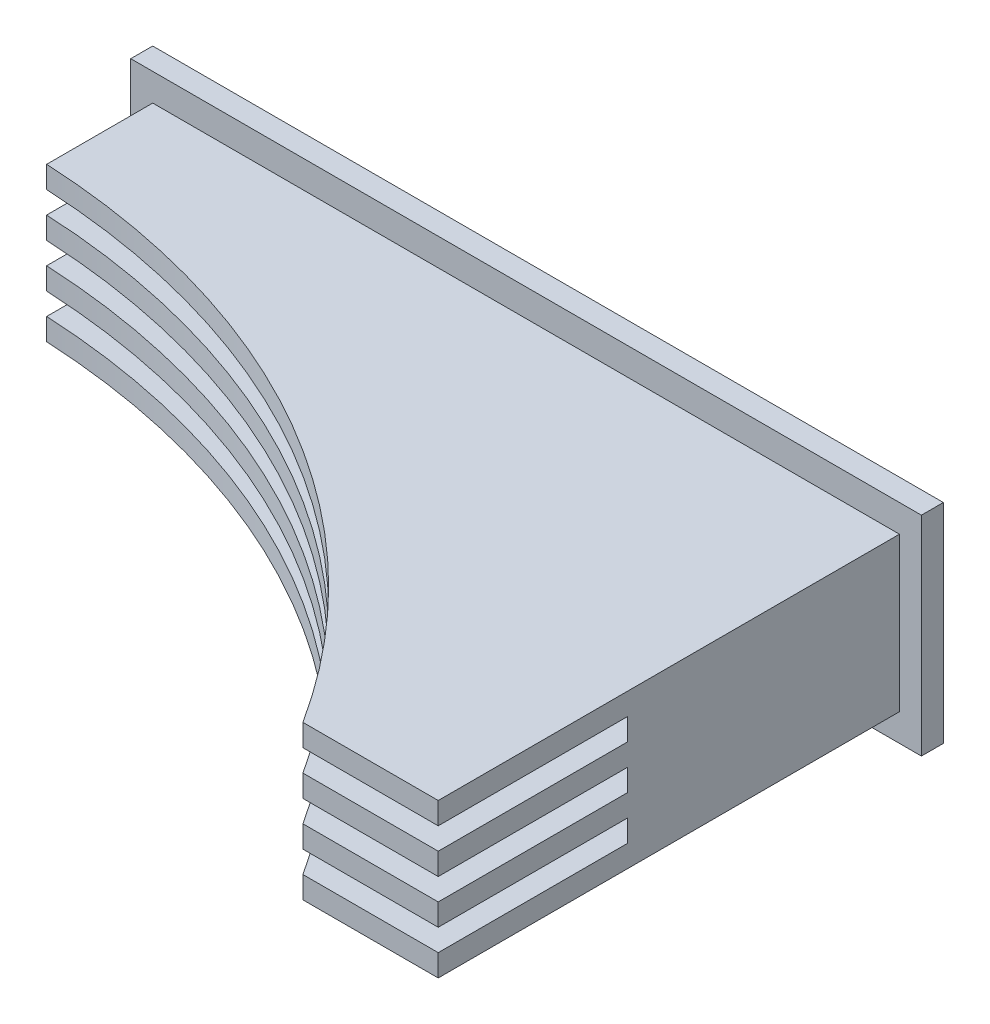
ISO-10303-21;
HEADER;
FILE_DESCRIPTION(('STEP AP214'),'2;1');
FILE_NAME('part.step','',(''),(''),'','','');
FILE_SCHEMA(('AUTOMOTIVE_DESIGN { 1 0 10303 214 1 1 1 1 }'));
ENDSEC;
DATA;
#1=APPLICATION_CONTEXT('core data for automotive mechanical design processes');
#2=APPLICATION_PROTOCOL_DEFINITION('international standard','automotive_design',2000,#1);
#3=PRODUCT_CONTEXT('',#1,'mechanical');
#4=PRODUCT('Part','Part','',(#3));
#5=PRODUCT_RELATED_PRODUCT_CATEGORY('part','',(#4));
#6=PRODUCT_DEFINITION_FORMATION('','',#4);
#7=PRODUCT_DEFINITION_CONTEXT('part definition',#1,'design');
#8=PRODUCT_DEFINITION('design','',#6,#7);
#9=PRODUCT_DEFINITION_SHAPE('','',#8);
#10=(LENGTH_UNIT() NAMED_UNIT(*) SI_UNIT(.MILLI.,.METRE.));
#11=(NAMED_UNIT(*) PLANE_ANGLE_UNIT() SI_UNIT($,.RADIAN.));
#12=(NAMED_UNIT(*) SI_UNIT($,.STERADIAN.) SOLID_ANGLE_UNIT());
#13=UNCERTAINTY_MEASURE_WITH_UNIT(LENGTH_MEASURE(1.E-05),#10,'distance_accuracy_value','');
#14=(GEOMETRIC_REPRESENTATION_CONTEXT(3) GLOBAL_UNCERTAINTY_ASSIGNED_CONTEXT((#13)) GLOBAL_UNIT_ASSIGNED_CONTEXT((#10,
#11,#12)) REPRESENTATION_CONTEXT('',''));
#15=CARTESIAN_POINT('',(0.,0.,0.));
#16=DIRECTION('',(0.,0.,1.));
#17=DIRECTION('',(1.,0.,0.));
#18=AXIS2_PLACEMENT_3D('',#15,#16,#17);
#19=CARTESIAN_POINT('',(-18.,15.5,1.));
#20=DIRECTION('',(0.,0.,1.));
#21=DIRECTION('',(1.,0.,0.));
#22=AXIS2_PLACEMENT_3D('',#19,#20,#21);
#23=PLANE('',#22);
#24=DIRECTION('',(0.,1.,0.));
#25=VECTOR('',#24,1.);
#26=CARTESIAN_POINT('',(17.,14.25,1.));
#27=LINE('',#26,#25);
#28=CARTESIAN_POINT('',(17.,7.25,1.));
#29=VERTEX_POINT('',#28);
#30=CARTESIAN_POINT('',(17.,14.25,1.));
#31=VERTEX_POINT('',#30);
#32=EDGE_CURVE('E370',#29,#31,#27,.T.);
#33=ORIENTED_EDGE('',*,*,#32,.F.);
#34=DIRECTION('',(-1.,0.,0.));
#35=VECTOR('',#34,1.);
#36=CARTESIAN_POINT('',(-18.,7.25,1.));
#37=LINE('',#36,#35);
#38=CARTESIAN_POINT('',(-17.,7.25,1.));
#39=VERTEX_POINT('',#38);
#40=EDGE_CURVE('E262',#29,#39,#37,.T.);
#41=ORIENTED_EDGE('',*,*,#40,.T.);
#42=DIRECTION('',(0.,1.,0.));
#43=VECTOR('',#42,1.);
#44=CARTESIAN_POINT('',(-17.,15.5,1.));
#45=LINE('',#44,#43);
#46=CARTESIAN_POINT('',(-17.,8.25,1.));
#47=VERTEX_POINT('',#46);
#48=EDGE_CURVE('E264',#39,#47,#45,.T.);
#49=ORIENTED_EDGE('',*,*,#48,.T.);
#50=DIRECTION('',(1.,0.,0.));
#51=VECTOR('',#50,1.);
#52=CARTESIAN_POINT('',(-18.,8.25,1.));
#53=LINE('',#52,#51);
#54=CARTESIAN_POINT('',(2.31515690696468,8.25,1.));
#55=VERTEX_POINT('',#54);
#56=EDGE_CURVE('E260',#47,#55,#53,.T.);
#57=ORIENTED_EDGE('',*,*,#56,.T.);
#58=DIRECTION('',(0.,1.,0.));
#59=VECTOR('',#58,1.);
#60=CARTESIAN_POINT('',(2.31515690696469,-11.9598693934321,1.00000000000001));
#61=LINE('',#60,#59);
#62=CARTESIAN_POINT('',(2.31515690696469,9.25000000000001,1.00000000000001));
#63=VERTEX_POINT('',#62);
#64=EDGE_CURVE('E223',#55,#63,#61,.T.);
#65=ORIENTED_EDGE('',*,*,#64,.T.);
#66=DIRECTION('',(-1.,0.,0.));
#67=VECTOR('',#66,1.);
#68=CARTESIAN_POINT('',(-18.,9.25,1.));
#69=LINE('',#68,#67);
#70=CARTESIAN_POINT('',(-17.,9.25,1.));
#71=VERTEX_POINT('',#70);
#72=EDGE_CURVE('E297',#63,#71,#69,.T.);
#73=ORIENTED_EDGE('',*,*,#72,.T.);
#74=DIRECTION('',(0.,1.,0.));
#75=VECTOR('',#74,1.);
#76=CARTESIAN_POINT('',(-17.,15.5,1.));
#77=LINE('',#76,#75);
#78=CARTESIAN_POINT('',(-17.,10.25,1.));
#79=VERTEX_POINT('',#78);
#80=EDGE_CURVE('E299',#71,#79,#77,.T.);
#81=ORIENTED_EDGE('',*,*,#80,.T.);
#82=DIRECTION('',(1.,0.,0.));
#83=VECTOR('',#82,1.);
#84=CARTESIAN_POINT('',(-18.,10.25,1.));
#85=LINE('',#84,#83);
#86=CARTESIAN_POINT('',(2.31515690696468,10.25,1.));
#87=VERTEX_POINT('',#86);
#88=EDGE_CURVE('E294',#79,#87,#85,.T.);
#89=ORIENTED_EDGE('',*,*,#88,.T.);
#90=CARTESIAN_POINT('',(2.31515690696469,11.25,1.00000000000001));
#91=VERTEX_POINT('',#90);
#92=EDGE_CURVE('E64',#87,#91,#61,.T.);
#93=ORIENTED_EDGE('',*,*,#92,.T.);
#94=DIRECTION('',(-1.,0.,0.));
#95=VECTOR('',#94,1.);
#96=CARTESIAN_POINT('',(-18.,11.25,1.));
#97=LINE('',#96,#95);
#98=CARTESIAN_POINT('',(-17.,11.25,1.));
#99=VERTEX_POINT('',#98);
#100=EDGE_CURVE('E334',#91,#99,#97,.T.);
#101=ORIENTED_EDGE('',*,*,#100,.T.);
#102=DIRECTION('',(0.,1.,0.));
#103=VECTOR('',#102,1.);
#104=CARTESIAN_POINT('',(-17.,15.5,1.));
#105=LINE('',#104,#103);
#106=CARTESIAN_POINT('',(-17.,12.25,1.));
#107=VERTEX_POINT('',#106);
#108=EDGE_CURVE('E336',#99,#107,#105,.T.);
#109=ORIENTED_EDGE('',*,*,#108,.T.);
#110=DIRECTION('',(1.,0.,0.));
#111=VECTOR('',#110,1.);
#112=CARTESIAN_POINT('',(-18.,12.25,1.));
#113=LINE('',#112,#111);
#114=CARTESIAN_POINT('',(2.31515690696468,12.25,1.));
#115=VERTEX_POINT('',#114);
#116=EDGE_CURVE('E331',#107,#115,#113,.T.);
#117=ORIENTED_EDGE('',*,*,#116,.T.);
#118=CARTESIAN_POINT('',(2.31515690696469,13.25,1.00000000000001));
#119=VERTEX_POINT('',#118);
#120=EDGE_CURVE('E56',#115,#119,#61,.T.);
#121=ORIENTED_EDGE('',*,*,#120,.T.);
#122=DIRECTION('',(1.,0.,0.));
#123=VECTOR('',#122,1.);
#124=CARTESIAN_POINT('',(-17.,13.25,1.));
#125=LINE('',#124,#123);
#126=CARTESIAN_POINT('',(-17.,13.25,1.));
#127=VERTEX_POINT('',#126);
#128=EDGE_CURVE('E373',#127,#119,#125,.T.);
#129=ORIENTED_EDGE('',*,*,#128,.F.);
#130=DIRECTION('',(0.,-1.,0.));
#131=VECTOR('',#130,1.);
#132=CARTESIAN_POINT('',(-17.,14.25,1.));
#133=LINE('',#132,#131);
#134=CARTESIAN_POINT('',(-17.,14.25,1.));
#135=VERTEX_POINT('',#134);
#136=EDGE_CURVE('E376',#135,#127,#133,.T.);
#137=ORIENTED_EDGE('',*,*,#136,.F.);
#138=DIRECTION('',(-1.,0.,0.));
#139=VECTOR('',#138,1.);
#140=CARTESIAN_POINT('',(-17.,14.25,1.));
#141=LINE('',#140,#139);
#142=EDGE_CURVE('E49',#31,#135,#141,.T.);
#143=ORIENTED_EDGE('',*,*,#142,.F.);
#144=EDGE_LOOP('',(#33,#41,#49,#57,#65,#73,#81,#89,#93,#101,#109,#117,#121,#129,#137,#143));
#145=FACE_BOUND('',#144,.T.);
#146=DIRECTION('',(-1.,0.,0.));
#147=VECTOR('',#146,1.);
#148=CARTESIAN_POINT('',(18.,15.5,1.));
#149=LINE('',#148,#147);
#150=CARTESIAN_POINT('',(18.,15.5,1.));
#151=VERTEX_POINT('',#150);
#152=CARTESIAN_POINT('',(-18.,15.5,1.));
#153=VERTEX_POINT('',#152);
#154=EDGE_CURVE('E340',#151,#153,#149,.T.);
#155=ORIENTED_EDGE('',*,*,#154,.T.);
#156=DIRECTION('',(0.,-1.,0.));
#157=VECTOR('',#156,1.);
#158=CARTESIAN_POINT('',(-18.,15.5,1.));
#159=LINE('',#158,#157);
#160=CARTESIAN_POINT('',(-18.,6.,1.));
#161=VERTEX_POINT('',#160);
#162=EDGE_CURVE('E343',#153,#161,#159,.T.);
#163=ORIENTED_EDGE('',*,*,#162,.T.);
#164=DIRECTION('',(1.,0.,0.));
#165=VECTOR('',#164,1.);
#166=CARTESIAN_POINT('',(-16.,6.,1.));
#167=LINE('',#166,#165);
#168=CARTESIAN_POINT('',(18.,6.,1.));
#169=VERTEX_POINT('',#168);
#170=EDGE_CURVE('E346',#161,#169,#167,.T.);
#171=ORIENTED_EDGE('',*,*,#170,.T.);
#172=DIRECTION('',(0.,1.,0.));
#173=VECTOR('',#172,1.);
#174=CARTESIAN_POINT('',(18.,6.,1.));
#175=LINE('',#174,#173);
#176=EDGE_CURVE('E348',#169,#151,#175,.T.);
#177=ORIENTED_EDGE('',*,*,#176,.T.);
#178=EDGE_LOOP('',(#155,#163,#171,#177));
#179=FACE_BOUND('',#178,.T.);
#180=ADVANCED_FACE('F41',(#145,#179),#23,.T.);
#181=CARTESIAN_POINT('',(-17.,14.25,22.));
#182=DIRECTION('',(1.,0.,0.));
#183=DIRECTION('',(0.,0.,-1.));
#184=AXIS2_PLACEMENT_3D('',#181,#182,#183);
#185=PLANE('',#184);
#186=DIRECTION('',(0.,0.,-1.));
#187=VECTOR('',#186,1.);
#188=CARTESIAN_POINT('',(-17.,14.25,22.));
#189=LINE('',#188,#187);
#190=CARTESIAN_POINT('',(-17.,14.25,5.82981428452992));
#191=VERTEX_POINT('',#190);
#192=EDGE_CURVE('E393',#191,#135,#189,.T.);
#193=ORIENTED_EDGE('',*,*,#192,.T.);
#194=ORIENTED_EDGE('',*,*,#136,.T.);
#195=DIRECTION('',(0.,0.,-1.));
#196=VECTOR('',#195,1.);
#197=CARTESIAN_POINT('',(-17.,13.25,22.));
#198=LINE('',#197,#196);
#199=CARTESIAN_POINT('',(-17.,13.25,5.82981428452992));
#200=VERTEX_POINT('',#199);
#201=EDGE_CURVE('E400',#200,#127,#198,.T.);
#202=ORIENTED_EDGE('',*,*,#201,.F.);
#203=DIRECTION('',(0.,-1.,0.));
#204=VECTOR('',#203,1.);
#205=CARTESIAN_POINT('',(-17.,74.3718064700863,5.82981428452992));
#206=LINE('',#205,#204);
#207=EDGE_CURVE('E379',#191,#200,#206,.T.);
#208=ORIENTED_EDGE('',*,*,#207,.F.);
#209=EDGE_LOOP('',(#193,#194,#202,#208));
#210=FACE_BOUND('',#209,.T.);
#211=ADVANCED_FACE('F43',(#210),#185,.F.);
#212=CARTESIAN_POINT('',(-17.,13.25,22.));
#213=DIRECTION('',(0.,1.,0.));
#214=DIRECTION('',(0.,0.,1.));
#215=AXIS2_PLACEMENT_3D('',#212,#213,#214);
#216=PLANE('',#215);
#217=ORIENTED_EDGE('',*,*,#128,.T.);
#218=CARTESIAN_POINT('',(-18.7210098337758,13.25,40.8421058876592));
#219=DIRECTION('',(0.,1.,0.));
#220=DIRECTION('',(0.,0.,1.));
#221=AXIS2_PLACEMENT_3D('',#218,#219,#220);
#222=CIRCLE('',#221,45.0545637278588);
#223=CARTESIAN_POINT('',(17.,13.25,13.3844444948352));
#224=VERTEX_POINT('',#223);
#225=EDGE_CURVE('E504',#119,#224,#222,.F.);
#226=ORIENTED_EDGE('',*,*,#225,.T.);
#227=DIRECTION('',(0.,0.,-1.));
#228=VECTOR('',#227,1.);
#229=CARTESIAN_POINT('',(17.,13.25,22.));
#230=LINE('',#229,#228);
#231=CARTESIAN_POINT('',(17.,13.25,22.));
#232=VERTEX_POINT('',#231);
#233=EDGE_CURVE('E398',#232,#224,#230,.T.);
#234=ORIENTED_EDGE('',*,*,#233,.F.);
#235=DIRECTION('',(1.,0.,0.));
#236=VECTOR('',#235,1.);
#237=CARTESIAN_POINT('',(-17.,13.25,22.));
#238=LINE('',#237,#236);
#239=CARTESIAN_POINT('',(10.8390558608188,13.25,22.));
#240=VERTEX_POINT('',#239);
#241=EDGE_CURVE('E387',#240,#232,#238,.T.);
#242=ORIENTED_EDGE('',*,*,#241,.F.);
#243=CARTESIAN_POINT('',(-18.7210098337758,13.25,40.8421058876592));
#244=DIRECTION('',(0.,1.,0.));
#245=DIRECTION('',(0.,0.,1.));
#246=AXIS2_PLACEMENT_3D('',#243,#244,#245);
#247=CIRCLE('',#246,35.0545637278588);
#248=EDGE_CURVE('E385',#240,#200,#247,.T.);
#249=ORIENTED_EDGE('',*,*,#248,.T.);
#250=ORIENTED_EDGE('',*,*,#201,.T.);
#251=EDGE_LOOP('',(#217,#226,#234,#242,#249,#250));
#252=FACE_BOUND('',#251,.T.);
#253=ADVANCED_FACE('F467',(#252),#216,.F.);
#254=CARTESIAN_POINT('',(17.,14.25,22.));
#255=DIRECTION('',(-1.,0.,0.));
#256=DIRECTION('',(0.,-1.,0.));
#257=AXIS2_PLACEMENT_3D('',#254,#255,#256);
#258=PLANE('',#257);
#259=ORIENTED_EDGE('',*,*,#233,.T.);
#260=DIRECTION('',(0.,1.,0.));
#261=VECTOR('',#260,1.);
#262=CARTESIAN_POINT('',(17.,-11.9598693934321,13.3844444948352));
#263=LINE('',#262,#261);
#264=CARTESIAN_POINT('',(17.,12.25,13.3844444948352));
#265=VERTEX_POINT('',#264);
#266=EDGE_CURVE('E241',#265,#224,#263,.T.);
#267=ORIENTED_EDGE('',*,*,#266,.F.);
#268=DIRECTION('',(0.,0.,-1.));
#269=VECTOR('',#268,1.);
#270=CARTESIAN_POINT('',(17.,12.25,22.));
#271=LINE('',#270,#269);
#272=CARTESIAN_POINT('',(17.,12.25,22.));
#273=VERTEX_POINT('',#272);
#274=EDGE_CURVE('E319',#273,#265,#271,.T.);
#275=ORIENTED_EDGE('',*,*,#274,.F.);
#276=DIRECTION('',(0.,1.,0.));
#277=VECTOR('',#276,1.);
#278=CARTESIAN_POINT('',(17.,12.25,22.));
#279=LINE('',#278,#277);
#280=CARTESIAN_POINT('',(17.,11.25,22.));
#281=VERTEX_POINT('',#280);
#282=EDGE_CURVE('E312',#281,#273,#279,.T.);
#283=ORIENTED_EDGE('',*,*,#282,.F.);
#284=DIRECTION('',(0.,0.,-1.));
#285=VECTOR('',#284,1.);
#286=CARTESIAN_POINT('',(17.,11.25,22.));
#287=LINE('',#286,#285);
#288=CARTESIAN_POINT('',(17.,11.25,13.3844444948352));
#289=VERTEX_POINT('',#288);
#290=EDGE_CURVE('E322',#281,#289,#287,.T.);
#291=ORIENTED_EDGE('',*,*,#290,.T.);
#292=CARTESIAN_POINT('',(17.,10.25,13.3844444948352));
#293=VERTEX_POINT('',#292);
#294=EDGE_CURVE('E239',#293,#289,#263,.T.);
#295=ORIENTED_EDGE('',*,*,#294,.F.);
#296=DIRECTION('',(0.,0.,-1.));
#297=VECTOR('',#296,1.);
#298=CARTESIAN_POINT('',(17.,10.25,22.));
#299=LINE('',#298,#297);
#300=CARTESIAN_POINT('',(17.,10.25,22.));
#301=VERTEX_POINT('',#300);
#302=EDGE_CURVE('E284',#301,#293,#299,.T.);
#303=ORIENTED_EDGE('',*,*,#302,.F.);
#304=DIRECTION('',(0.,1.,0.));
#305=VECTOR('',#304,1.);
#306=CARTESIAN_POINT('',(17.,10.25,22.));
#307=LINE('',#306,#305);
#308=CARTESIAN_POINT('',(17.,9.25,22.));
#309=VERTEX_POINT('',#308);
#310=EDGE_CURVE('E277',#309,#301,#307,.T.);
#311=ORIENTED_EDGE('',*,*,#310,.F.);
#312=DIRECTION('',(0.,0.,-1.));
#313=VECTOR('',#312,1.);
#314=CARTESIAN_POINT('',(17.,9.25,22.));
#315=LINE('',#314,#313);
#316=CARTESIAN_POINT('',(17.,9.25,13.3844444948352));
#317=VERTEX_POINT('',#316);
#318=EDGE_CURVE('E237',#309,#317,#315,.T.);
#319=ORIENTED_EDGE('',*,*,#318,.T.);
#320=CARTESIAN_POINT('',(17.,8.25,13.3844444948352));
#321=VERTEX_POINT('',#320);
#322=EDGE_CURVE('E220',#321,#317,#263,.T.);
#323=ORIENTED_EDGE('',*,*,#322,.F.);
#324=DIRECTION('',(0.,0.,-1.));
#325=VECTOR('',#324,1.);
#326=CARTESIAN_POINT('',(17.,8.25,22.));
#327=LINE('',#326,#325);
#328=CARTESIAN_POINT('',(17.,8.25,22.));
#329=VERTEX_POINT('',#328);
#330=EDGE_CURVE('E233',#329,#321,#327,.T.);
#331=ORIENTED_EDGE('',*,*,#330,.F.);
#332=DIRECTION('',(0.,1.,0.));
#333=VECTOR('',#332,1.);
#334=CARTESIAN_POINT('',(17.,8.25,22.));
#335=LINE('',#334,#333);
#336=CARTESIAN_POINT('',(17.,7.25,22.));
#337=VERTEX_POINT('',#336);
#338=EDGE_CURVE('E442',#337,#329,#335,.T.);
#339=ORIENTED_EDGE('',*,*,#338,.F.);
#340=DIRECTION('',(0.,0.,-1.));
#341=VECTOR('',#340,1.);
#342=CARTESIAN_POINT('',(17.,7.25,22.));
#343=LINE('',#342,#341);
#344=EDGE_CURVE('E245',#337,#29,#343,.T.);
#345=ORIENTED_EDGE('',*,*,#344,.T.);
#346=ORIENTED_EDGE('',*,*,#32,.T.);
#347=DIRECTION('',(0.,0.,-1.));
#348=VECTOR('',#347,1.);
#349=CARTESIAN_POINT('',(17.,14.25,22.));
#350=LINE('',#349,#348);
#351=CARTESIAN_POINT('',(17.,14.25,22.));
#352=VERTEX_POINT('',#351);
#353=EDGE_CURVE('E396',#352,#31,#350,.T.);
#354=ORIENTED_EDGE('',*,*,#353,.F.);
#355=DIRECTION('',(0.,1.,0.));
#356=VECTOR('',#355,1.);
#357=CARTESIAN_POINT('',(17.,14.25,22.));
#358=LINE('',#357,#356);
#359=EDGE_CURVE('E389',#232,#352,#358,.T.);
#360=ORIENTED_EDGE('',*,*,#359,.F.);
#361=EDGE_LOOP('',(#259,#267,#275,#283,#291,#295,#303,#311,#319,#323,#331,#339,#345,#346,#354,#360));
#362=FACE_BOUND('',#361,.T.);
#363=ADVANCED_FACE('F231',(#362),#258,.F.);
#364=CARTESIAN_POINT('',(-17.,14.25,22.));
#365=DIRECTION('',(0.,-1.,0.));
#366=DIRECTION('',(1.,0.,0.));
#367=AXIS2_PLACEMENT_3D('',#364,#365,#366);
#368=PLANE('',#367);
#369=ORIENTED_EDGE('',*,*,#353,.T.);
#370=ORIENTED_EDGE('',*,*,#142,.T.);
#371=ORIENTED_EDGE('',*,*,#192,.F.);
#372=CARTESIAN_POINT('',(-18.7210098337758,14.25,40.8421058876592));
#373=DIRECTION('',(0.,-1.,0.));
#374=DIRECTION('',(1.,0.,0.));
#375=AXIS2_PLACEMENT_3D('',#372,#373,#374);
#376=CIRCLE('',#375,35.0545637278588);
#377=CARTESIAN_POINT('',(10.8390558608187,14.25,22.));
#378=VERTEX_POINT('',#377);
#379=EDGE_CURVE('E382',#191,#378,#376,.T.);
#380=ORIENTED_EDGE('',*,*,#379,.T.);
#381=DIRECTION('',(-1.,0.,0.));
#382=VECTOR('',#381,1.);
#383=CARTESIAN_POINT('',(-17.,14.25,22.));
#384=LINE('',#383,#382);
#385=EDGE_CURVE('E391',#352,#378,#384,.T.);
#386=ORIENTED_EDGE('',*,*,#385,.F.);
#387=EDGE_LOOP('',(#369,#370,#371,#380,#386));
#388=FACE_BOUND('',#387,.T.);
#389=ADVANCED_FACE('F409',(#388),#368,.F.);
#390=CARTESIAN_POINT('',(-17.,13.25,22.));
#391=DIRECTION('',(0.,0.,1.));
#392=DIRECTION('',(1.,0.,0.));
#393=AXIS2_PLACEMENT_3D('',#390,#391,#392);
#394=PLANE('',#393);
#395=DIRECTION('',(0.,-1.,0.));
#396=VECTOR('',#395,1.);
#397=CARTESIAN_POINT('',(10.8390558608188,74.3718064700863,22.));
#398=LINE('',#397,#396);
#399=EDGE_CURVE('E403',#240,#378,#398,.F.);
#400=ORIENTED_EDGE('',*,*,#399,.F.);
#401=ORIENTED_EDGE('',*,*,#241,.T.);
#402=ORIENTED_EDGE('',*,*,#359,.T.);
#403=ORIENTED_EDGE('',*,*,#385,.T.);
#404=EDGE_LOOP('',(#400,#401,#402,#403));
#405=FACE_BOUND('',#404,.T.);
#406=ADVANCED_FACE('F421',(#405),#394,.T.);
#407=CARTESIAN_POINT('',(-18.7210098337758,74.3718064700863,40.8421058876592));
#408=DIRECTION('',(0.,-1.,0.));
#409=DIRECTION('',(1.,0.,0.));
#410=AXIS2_PLACEMENT_3D('',#407,#408,#409);
#411=CYLINDRICAL_SURFACE('',#410,35.0545637278588);
#412=ORIENTED_EDGE('',*,*,#248,.F.);
#413=ORIENTED_EDGE('',*,*,#399,.T.);
#414=ORIENTED_EDGE('',*,*,#379,.F.);
#415=ORIENTED_EDGE('',*,*,#207,.T.);
#416=EDGE_LOOP('',(#412,#413,#414,#415));
#417=FACE_BOUND('',#416,.T.);
#418=ADVANCED_FACE('F419',(#417),#411,.F.);
#419=CARTESIAN_POINT('',(18.,15.5,1.));
#420=DIRECTION('',(0.,-1.,0.));
#421=DIRECTION('',(0.,0.,-1.));
#422=AXIS2_PLACEMENT_3D('',#419,#420,#421);
#423=PLANE('',#422);
#424=DIRECTION('',(-1.,0.,0.));
#425=VECTOR('',#424,1.);
#426=CARTESIAN_POINT('',(18.,15.5,0.));
#427=LINE('',#426,#425);
#428=CARTESIAN_POINT('',(18.,15.5,0.));
#429=VERTEX_POINT('',#428);
#430=CARTESIAN_POINT('',(-18.,15.5,0.));
#431=VERTEX_POINT('',#430);
#432=EDGE_CURVE('E339',#429,#431,#427,.T.);
#433=ORIENTED_EDGE('',*,*,#432,.T.);
#434=DIRECTION('',(0.,0.,-1.));
#435=VECTOR('',#434,1.);
#436=CARTESIAN_POINT('',(-18.,15.5,1.));
#437=LINE('',#436,#435);
#438=EDGE_CURVE('E367',#153,#431,#437,.T.);
#439=ORIENTED_EDGE('',*,*,#438,.F.);
#440=ORIENTED_EDGE('',*,*,#154,.F.);
#441=DIRECTION('',(0.,0.,-1.));
#442=VECTOR('',#441,1.);
#443=CARTESIAN_POINT('',(18.,15.5,1.));
#444=LINE('',#443,#442);
#445=EDGE_CURVE('E350',#151,#429,#444,.T.);
#446=ORIENTED_EDGE('',*,*,#445,.T.);
#447=EDGE_LOOP('',(#433,#439,#440,#446));
#448=FACE_BOUND('',#447,.T.);
#449=ADVANCED_FACE('F484',(#448),#423,.F.);
#450=CARTESIAN_POINT('',(-18.,15.5,1.));
#451=DIRECTION('',(1.,0.,0.));
#452=DIRECTION('',(0.,0.,-1.));
#453=AXIS2_PLACEMENT_3D('',#450,#451,#452);
#454=PLANE('',#453);
#455=DIRECTION('',(0.,-1.,0.));
#456=VECTOR('',#455,1.);
#457=CARTESIAN_POINT('',(-18.,15.5,0.));
#458=LINE('',#457,#456);
#459=CARTESIAN_POINT('',(-18.,6.,0.));
#460=VERTEX_POINT('',#459);
#461=EDGE_CURVE('E353',#431,#460,#458,.T.);
#462=ORIENTED_EDGE('',*,*,#461,.T.);
#463=DIRECTION('',(0.,0.,-1.));
#464=VECTOR('',#463,1.);
#465=CARTESIAN_POINT('',(-18.,6.,1.));
#466=LINE('',#465,#464);
#467=EDGE_CURVE('E364',#161,#460,#466,.T.);
#468=ORIENTED_EDGE('',*,*,#467,.F.);
#469=ORIENTED_EDGE('',*,*,#162,.F.);
#470=ORIENTED_EDGE('',*,*,#438,.T.);
#471=EDGE_LOOP('',(#462,#468,#469,#470));
#472=FACE_BOUND('',#471,.T.);
#473=ADVANCED_FACE('F480',(#472),#454,.F.);
#474=CARTESIAN_POINT('',(16.,6.,1.));
#475=DIRECTION('',(0.,1.,0.));
#476=DIRECTION('',(0.,0.,1.));
#477=AXIS2_PLACEMENT_3D('',#474,#475,#476);
#478=PLANE('',#477);
#479=DIRECTION('',(1.,0.,0.));
#480=VECTOR('',#479,1.);
#481=CARTESIAN_POINT('',(16.,6.,0.));
#482=LINE('',#481,#480);
#483=CARTESIAN_POINT('',(18.,6.,0.));
#484=VERTEX_POINT('',#483);
#485=EDGE_CURVE('E356',#460,#484,#482,.T.);
#486=ORIENTED_EDGE('',*,*,#485,.T.);
#487=DIRECTION('',(0.,0.,-1.));
#488=VECTOR('',#487,1.);
#489=CARTESIAN_POINT('',(18.,6.,1.));
#490=LINE('',#489,#488);
#491=EDGE_CURVE('E361',#169,#484,#490,.T.);
#492=ORIENTED_EDGE('',*,*,#491,.F.);
#493=ORIENTED_EDGE('',*,*,#170,.F.);
#494=ORIENTED_EDGE('',*,*,#467,.T.);
#495=EDGE_LOOP('',(#486,#492,#493,#494));
#496=FACE_BOUND('',#495,.T.);
#497=ADVANCED_FACE('F476',(#496),#478,.F.);
#498=CARTESIAN_POINT('',(18.,6.,1.));
#499=DIRECTION('',(-1.,0.,0.));
#500=DIRECTION('',(0.,0.,1.));
#501=AXIS2_PLACEMENT_3D('',#498,#499,#500);
#502=PLANE('',#501);
#503=DIRECTION('',(0.,1.,0.));
#504=VECTOR('',#503,1.);
#505=CARTESIAN_POINT('',(18.,6.,0.));
#506=LINE('',#505,#504);
#507=EDGE_CURVE('E344',#484,#429,#506,.T.);
#508=ORIENTED_EDGE('',*,*,#507,.T.);
#509=ORIENTED_EDGE('',*,*,#445,.F.);
#510=ORIENTED_EDGE('',*,*,#176,.F.);
#511=ORIENTED_EDGE('',*,*,#491,.T.);
#512=EDGE_LOOP('',(#508,#509,#510,#511));
#513=FACE_BOUND('',#512,.T.);
#514=ADVANCED_FACE('F472',(#513),#502,.F.);
#515=CARTESIAN_POINT('',(-17.,13.25,0.));
#516=DIRECTION('',(0.,0.,1.));
#517=DIRECTION('',(1.,0.,0.));
#518=AXIS2_PLACEMENT_3D('',#515,#516,#517);
#519=PLANE('',#518);
#520=ORIENTED_EDGE('',*,*,#432,.F.);
#521=ORIENTED_EDGE('',*,*,#507,.F.);
#522=ORIENTED_EDGE('',*,*,#485,.F.);
#523=ORIENTED_EDGE('',*,*,#461,.F.);
#524=EDGE_LOOP('',(#520,#521,#522,#523));
#525=FACE_BOUND('',#524,.T.);
#526=ADVANCED_FACE('F475',(#525),#519,.F.);
#527=CARTESIAN_POINT('',(-17.,12.25,22.));
#528=DIRECTION('',(1.,0.,0.));
#529=DIRECTION('',(0.,0.,-1.));
#530=AXIS2_PLACEMENT_3D('',#527,#528,#529);
#531=PLANE('',#530);
#532=ORIENTED_EDGE('',*,*,#108,.F.);
#533=DIRECTION('',(0.,0.,-1.));
#534=VECTOR('',#533,1.);
#535=CARTESIAN_POINT('',(-17.,11.25,22.));
#536=LINE('',#535,#534);
#537=CARTESIAN_POINT('',(-17.,11.25,5.82981428452992));
#538=VERTEX_POINT('',#537);
#539=EDGE_CURVE('E325',#538,#99,#536,.T.);
#540=ORIENTED_EDGE('',*,*,#539,.F.);
#541=DIRECTION('',(0.,-1.,0.));
#542=VECTOR('',#541,1.);
#543=CARTESIAN_POINT('',(-17.,74.3718064700863,5.82981428452992));
#544=LINE('',#543,#542);
#545=CARTESIAN_POINT('',(-17.,12.25,5.82981428452992));
#546=VERTEX_POINT('',#545);
#547=EDGE_CURVE('E302',#546,#538,#544,.T.);
#548=ORIENTED_EDGE('',*,*,#547,.F.);
#549=DIRECTION('',(0.,0.,-1.));
#550=VECTOR('',#549,1.);
#551=CARTESIAN_POINT('',(-17.,12.25,22.));
#552=LINE('',#551,#550);
#553=EDGE_CURVE('E316',#546,#107,#552,.T.);
#554=ORIENTED_EDGE('',*,*,#553,.T.);
#555=EDGE_LOOP('',(#532,#540,#548,#554));
#556=FACE_BOUND('',#555,.T.);
#557=ADVANCED_FACE('F470',(#556),#531,.F.);
#558=CARTESIAN_POINT('',(-17.,11.25,22.));
#559=DIRECTION('',(0.,1.,0.));
#560=DIRECTION('',(-1.,0.,0.));
#561=AXIS2_PLACEMENT_3D('',#558,#559,#560);
#562=PLANE('',#561);
#563=ORIENTED_EDGE('',*,*,#100,.F.);
#564=CARTESIAN_POINT('',(-18.7210098337758,11.25,40.8421058876592));
#565=DIRECTION('',(0.,1.,0.));
#566=DIRECTION('',(-1.,0.,0.));
#567=AXIS2_PLACEMENT_3D('',#564,#565,#566);
#568=CIRCLE('',#567,45.0545637278588);
#569=EDGE_CURVE('E525',#91,#289,#568,.F.);
#570=ORIENTED_EDGE('',*,*,#569,.T.);
#571=ORIENTED_EDGE('',*,*,#290,.F.);
#572=DIRECTION('',(1.,0.,0.));
#573=VECTOR('',#572,1.);
#574=CARTESIAN_POINT('',(-17.,11.25,22.));
#575=LINE('',#574,#573);
#576=CARTESIAN_POINT('',(10.8390558608188,11.25,22.));
#577=VERTEX_POINT('',#576);
#578=EDGE_CURVE('E310',#577,#281,#575,.T.);
#579=ORIENTED_EDGE('',*,*,#578,.F.);
#580=CARTESIAN_POINT('',(-18.7210098337758,11.25,40.8421058876592));
#581=DIRECTION('',(0.,1.,0.));
#582=DIRECTION('',(-1.,0.,0.));
#583=AXIS2_PLACEMENT_3D('',#580,#581,#582);
#584=CIRCLE('',#583,35.0545637278588);
#585=EDGE_CURVE('E308',#577,#538,#584,.T.);
#586=ORIENTED_EDGE('',*,*,#585,.T.);
#587=ORIENTED_EDGE('',*,*,#539,.T.);
#588=EDGE_LOOP('',(#563,#570,#571,#579,#586,#587));
#589=FACE_BOUND('',#588,.T.);
#590=ADVANCED_FACE('F523',(#589),#562,.F.);
#591=CARTESIAN_POINT('',(-17.,12.25,22.));
#592=DIRECTION('',(0.,-1.,0.));
#593=DIRECTION('',(0.,0.,-1.));
#594=AXIS2_PLACEMENT_3D('',#591,#592,#593);
#595=PLANE('',#594);
#596=ORIENTED_EDGE('',*,*,#274,.T.);
#597=CARTESIAN_POINT('',(-18.7210098337758,12.25,40.8421058876592));
#598=DIRECTION('',(0.,-1.,0.));
#599=DIRECTION('',(0.,0.,-1.));
#600=AXIS2_PLACEMENT_3D('',#597,#598,#599);
#601=CIRCLE('',#600,45.0545637278588);
#602=EDGE_CURVE('E511',#265,#115,#601,.F.);
#603=ORIENTED_EDGE('',*,*,#602,.T.);
#604=ORIENTED_EDGE('',*,*,#116,.F.);
#605=ORIENTED_EDGE('',*,*,#553,.F.);
#606=CARTESIAN_POINT('',(-18.7210098337758,12.25,40.8421058876592));
#607=DIRECTION('',(0.,-1.,0.));
#608=DIRECTION('',(0.,0.,-1.));
#609=AXIS2_PLACEMENT_3D('',#606,#607,#608);
#610=CIRCLE('',#609,35.0545637278588);
#611=CARTESIAN_POINT('',(10.8390558608187,12.25,22.));
#612=VERTEX_POINT('',#611);
#613=EDGE_CURVE('E305',#546,#612,#610,.T.);
#614=ORIENTED_EDGE('',*,*,#613,.T.);
#615=DIRECTION('',(-1.,0.,0.));
#616=VECTOR('',#615,1.);
#617=CARTESIAN_POINT('',(-17.,12.25,22.));
#618=LINE('',#617,#616);
#619=EDGE_CURVE('E314',#273,#612,#618,.T.);
#620=ORIENTED_EDGE('',*,*,#619,.F.);
#621=EDGE_LOOP('',(#596,#603,#604,#605,#614,#620));
#622=FACE_BOUND('',#621,.T.);
#623=ADVANCED_FACE('F510',(#622),#595,.F.);
#624=CARTESIAN_POINT('',(-17.,12.25,22.));
#625=DIRECTION('',(0.,0.,1.));
#626=DIRECTION('',(1.,0.,0.));
#627=AXIS2_PLACEMENT_3D('',#624,#625,#626);
#628=PLANE('',#627);
#629=DIRECTION('',(0.,-1.,0.));
#630=VECTOR('',#629,1.);
#631=CARTESIAN_POINT('',(10.8390558608188,74.3718064700863,22.));
#632=LINE('',#631,#630);
#633=EDGE_CURVE('E328',#577,#612,#632,.F.);
#634=ORIENTED_EDGE('',*,*,#633,.F.);
#635=ORIENTED_EDGE('',*,*,#578,.T.);
#636=ORIENTED_EDGE('',*,*,#282,.T.);
#637=ORIENTED_EDGE('',*,*,#619,.T.);
#638=EDGE_LOOP('',(#634,#635,#636,#637));
#639=FACE_BOUND('',#638,.T.);
#640=ADVANCED_FACE('F515',(#639),#628,.T.);
#641=CARTESIAN_POINT('',(-18.7210098337758,74.3718064700863,40.8421058876592));
#642=DIRECTION('',(0.,-1.,0.));
#643=DIRECTION('',(1.,0.,0.));
#644=AXIS2_PLACEMENT_3D('',#641,#642,#643);
#645=CYLINDRICAL_SURFACE('',#644,35.0545637278588);
#646=ORIENTED_EDGE('',*,*,#585,.F.);
#647=ORIENTED_EDGE('',*,*,#633,.T.);
#648=ORIENTED_EDGE('',*,*,#613,.F.);
#649=ORIENTED_EDGE('',*,*,#547,.T.);
#650=EDGE_LOOP('',(#646,#647,#648,#649));
#651=FACE_BOUND('',#650,.T.);
#652=ADVANCED_FACE('F553',(#651),#645,.F.);
#653=CARTESIAN_POINT('',(-17.,10.25,22.));
#654=DIRECTION('',(1.,0.,0.));
#655=DIRECTION('',(0.,0.,-1.));
#656=AXIS2_PLACEMENT_3D('',#653,#654,#655);
#657=PLANE('',#656);
#658=ORIENTED_EDGE('',*,*,#80,.F.);
#659=DIRECTION('',(0.,0.,-1.));
#660=VECTOR('',#659,1.);
#661=CARTESIAN_POINT('',(-17.,9.25,22.));
#662=LINE('',#661,#660);
#663=CARTESIAN_POINT('',(-17.,9.24999999999999,5.82981428452992));
#664=VERTEX_POINT('',#663);
#665=EDGE_CURVE('E288',#664,#71,#662,.T.);
#666=ORIENTED_EDGE('',*,*,#665,.F.);
#667=DIRECTION('',(0.,-1.,0.));
#668=VECTOR('',#667,1.);
#669=CARTESIAN_POINT('',(-17.,74.3718064700863,5.82981428452992));
#670=LINE('',#669,#668);
#671=CARTESIAN_POINT('',(-17.,10.25,5.82981428452992));
#672=VERTEX_POINT('',#671);
#673=EDGE_CURVE('E267',#672,#664,#670,.T.);
#674=ORIENTED_EDGE('',*,*,#673,.F.);
#675=DIRECTION('',(0.,0.,-1.));
#676=VECTOR('',#675,1.);
#677=CARTESIAN_POINT('',(-17.,10.25,22.));
#678=LINE('',#677,#676);
#679=EDGE_CURVE('E281',#672,#79,#678,.T.);
#680=ORIENTED_EDGE('',*,*,#679,.T.);
#681=EDGE_LOOP('',(#658,#666,#674,#680));
#682=FACE_BOUND('',#681,.T.);
#683=ADVANCED_FACE('F541',(#682),#657,.F.);
#684=CARTESIAN_POINT('',(-17.,9.25,22.));
#685=DIRECTION('',(0.,1.,0.));
#686=DIRECTION('',(-1.,0.,0.));
#687=AXIS2_PLACEMENT_3D('',#684,#685,#686);
#688=PLANE('',#687);
#689=ORIENTED_EDGE('',*,*,#72,.F.);
#690=CARTESIAN_POINT('',(-18.7210098337758,9.25,40.8421058876592));
#691=DIRECTION('',(0.,1.,0.));
#692=DIRECTION('',(-1.,0.,0.));
#693=AXIS2_PLACEMENT_3D('',#690,#691,#692);
#694=CIRCLE('',#693,45.0545637278588);
#695=EDGE_CURVE('E528',#63,#317,#694,.F.);
#696=ORIENTED_EDGE('',*,*,#695,.T.);
#697=ORIENTED_EDGE('',*,*,#318,.F.);
#698=DIRECTION('',(1.,0.,0.));
#699=VECTOR('',#698,1.);
#700=CARTESIAN_POINT('',(-17.,9.25,22.));
#701=LINE('',#700,#699);
#702=CARTESIAN_POINT('',(10.8390558608188,9.25,22.));
#703=VERTEX_POINT('',#702);
#704=EDGE_CURVE('E275',#703,#309,#701,.T.);
#705=ORIENTED_EDGE('',*,*,#704,.F.);
#706=CARTESIAN_POINT('',(-18.7210098337758,9.24999999999999,40.8421058876592));
#707=DIRECTION('',(0.,1.,0.));
#708=DIRECTION('',(-1.,0.,0.));
#709=AXIS2_PLACEMENT_3D('',#706,#707,#708);
#710=CIRCLE('',#709,35.0545637278588);
#711=EDGE_CURVE('E273',#703,#664,#710,.T.);
#712=ORIENTED_EDGE('',*,*,#711,.T.);
#713=ORIENTED_EDGE('',*,*,#665,.T.);
#714=EDGE_LOOP('',(#689,#696,#697,#705,#712,#713));
#715=FACE_BOUND('',#714,.T.);
#716=ADVANCED_FACE('F536',(#715),#688,.F.);
#717=CARTESIAN_POINT('',(-17.,10.25,22.));
#718=DIRECTION('',(0.,-1.,0.));
#719=DIRECTION('',(0.,0.,-1.));
#720=AXIS2_PLACEMENT_3D('',#717,#718,#719);
#721=PLANE('',#720);
#722=ORIENTED_EDGE('',*,*,#302,.T.);
#723=CARTESIAN_POINT('',(-18.7210098337758,10.25,40.8421058876592));
#724=DIRECTION('',(0.,-1.,0.));
#725=DIRECTION('',(0.,0.,-1.));
#726=AXIS2_PLACEMENT_3D('',#723,#724,#725);
#727=CIRCLE('',#726,45.0545637278588);
#728=EDGE_CURVE('E238',#293,#87,#727,.F.);
#729=ORIENTED_EDGE('',*,*,#728,.T.);
#730=ORIENTED_EDGE('',*,*,#88,.F.);
#731=ORIENTED_EDGE('',*,*,#679,.F.);
#732=CARTESIAN_POINT('',(-18.7210098337758,10.25,40.8421058876592));
#733=DIRECTION('',(0.,-1.,0.));
#734=DIRECTION('',(0.,0.,-1.));
#735=AXIS2_PLACEMENT_3D('',#732,#733,#734);
#736=CIRCLE('',#735,35.0545637278588);
#737=CARTESIAN_POINT('',(10.8390558608187,10.25,22.));
#738=VERTEX_POINT('',#737);
#739=EDGE_CURVE('E270',#672,#738,#736,.T.);
#740=ORIENTED_EDGE('',*,*,#739,.T.);
#741=DIRECTION('',(-1.,0.,0.));
#742=VECTOR('',#741,1.);
#743=CARTESIAN_POINT('',(-17.,10.25,22.));
#744=LINE('',#743,#742);
#745=EDGE_CURVE('E279',#301,#738,#744,.T.);
#746=ORIENTED_EDGE('',*,*,#745,.F.);
#747=EDGE_LOOP('',(#722,#729,#730,#731,#740,#746));
#748=FACE_BOUND('',#747,.T.);
#749=ADVANCED_FACE('F548',(#748),#721,.F.);
#750=CARTESIAN_POINT('',(-17.,10.25,22.));
#751=DIRECTION('',(0.,0.,1.));
#752=DIRECTION('',(1.,0.,0.));
#753=AXIS2_PLACEMENT_3D('',#750,#751,#752);
#754=PLANE('',#753);
#755=DIRECTION('',(0.,-1.,0.));
#756=VECTOR('',#755,1.);
#757=CARTESIAN_POINT('',(10.8390558608188,74.3718064700863,22.));
#758=LINE('',#757,#756);
#759=EDGE_CURVE('E291',#703,#738,#758,.F.);
#760=ORIENTED_EDGE('',*,*,#759,.F.);
#761=ORIENTED_EDGE('',*,*,#704,.T.);
#762=ORIENTED_EDGE('',*,*,#310,.T.);
#763=ORIENTED_EDGE('',*,*,#745,.T.);
#764=EDGE_LOOP('',(#760,#761,#762,#763));
#765=FACE_BOUND('',#764,.T.);
#766=ADVANCED_FACE('F647',(#765),#754,.T.);
#767=CARTESIAN_POINT('',(-18.7210098337758,74.3718064700863,40.8421058876592));
#768=DIRECTION('',(0.,-1.,0.));
#769=DIRECTION('',(1.,0.,0.));
#770=AXIS2_PLACEMENT_3D('',#767,#768,#769);
#771=CYLINDRICAL_SURFACE('',#770,35.0545637278588);
#772=ORIENTED_EDGE('',*,*,#711,.F.);
#773=ORIENTED_EDGE('',*,*,#759,.T.);
#774=ORIENTED_EDGE('',*,*,#739,.F.);
#775=ORIENTED_EDGE('',*,*,#673,.T.);
#776=EDGE_LOOP('',(#772,#773,#774,#775));
#777=FACE_BOUND('',#776,.T.);
#778=ADVANCED_FACE('F545',(#777),#771,.F.);
#779=CARTESIAN_POINT('',(-17.,8.25,22.));
#780=DIRECTION('',(1.,0.,0.));
#781=DIRECTION('',(0.,0.,-1.));
#782=AXIS2_PLACEMENT_3D('',#779,#780,#781);
#783=PLANE('',#782);
#784=ORIENTED_EDGE('',*,*,#48,.F.);
#785=DIRECTION('',(0.,0.,-1.));
#786=VECTOR('',#785,1.);
#787=CARTESIAN_POINT('',(-17.,7.25,22.));
#788=LINE('',#787,#786);
#789=CARTESIAN_POINT('',(-17.,7.25000000000001,5.82981428452992));
#790=VERTEX_POINT('',#789);
#791=EDGE_CURVE('E249',#790,#39,#788,.T.);
#792=ORIENTED_EDGE('',*,*,#791,.F.);
#793=DIRECTION('',(0.,-1.,0.));
#794=VECTOR('',#793,1.);
#795=CARTESIAN_POINT('',(-17.,74.3718064700863,5.82981428452992));
#796=LINE('',#795,#794);
#797=CARTESIAN_POINT('',(-17.,8.24999999999999,5.82981428452992));
#798=VERTEX_POINT('',#797);
#799=EDGE_CURVE('E444',#798,#790,#796,.T.);
#800=ORIENTED_EDGE('',*,*,#799,.F.);
#801=DIRECTION('',(0.,0.,-1.));
#802=VECTOR('',#801,1.);
#803=CARTESIAN_POINT('',(-17.,8.25,22.));
#804=LINE('',#803,#802);
#805=EDGE_CURVE('E246',#798,#47,#804,.T.);
#806=ORIENTED_EDGE('',*,*,#805,.T.);
#807=EDGE_LOOP('',(#784,#792,#800,#806));
#808=FACE_BOUND('',#807,.T.);
#809=ADVANCED_FACE('F431',(#808),#783,.F.);
#810=CARTESIAN_POINT('',(-17.,7.25,22.));
#811=DIRECTION('',(0.,1.,0.));
#812=DIRECTION('',(0.,0.,1.));
#813=AXIS2_PLACEMENT_3D('',#810,#811,#812);
#814=PLANE('',#813);
#815=ORIENTED_EDGE('',*,*,#791,.T.);
#816=ORIENTED_EDGE('',*,*,#40,.F.);
#817=ORIENTED_EDGE('',*,*,#344,.F.);
#818=DIRECTION('',(1.,0.,0.));
#819=VECTOR('',#818,1.);
#820=CARTESIAN_POINT('',(-17.,7.25,22.));
#821=LINE('',#820,#819);
#822=CARTESIAN_POINT('',(10.8390558608188,7.25,22.));
#823=VERTEX_POINT('',#822);
#824=EDGE_CURVE('E438',#823,#337,#821,.T.);
#825=ORIENTED_EDGE('',*,*,#824,.F.);
#826=CARTESIAN_POINT('',(-18.7210098337758,7.25000000000001,40.8421058876592));
#827=DIRECTION('',(0.,1.,0.));
#828=DIRECTION('',(0.,0.,1.));
#829=AXIS2_PLACEMENT_3D('',#826,#827,#828);
#830=CIRCLE('',#829,35.0545637278588);
#831=EDGE_CURVE('E437',#823,#790,#830,.T.);
#832=ORIENTED_EDGE('',*,*,#831,.T.);
#833=EDGE_LOOP('',(#815,#816,#817,#825,#832));
#834=FACE_BOUND('',#833,.T.);
#835=ADVANCED_FACE('F434',(#834),#814,.F.);
#836=CARTESIAN_POINT('',(-17.,8.25,22.));
#837=DIRECTION('',(0.,-1.,0.));
#838=DIRECTION('',(0.,0.,-1.));
#839=AXIS2_PLACEMENT_3D('',#836,#837,#838);
#840=PLANE('',#839);
#841=ORIENTED_EDGE('',*,*,#330,.T.);
#842=CARTESIAN_POINT('',(-18.7210098337758,8.25,40.8421058876592));
#843=DIRECTION('',(0.,-1.,0.));
#844=DIRECTION('',(0.,0.,-1.));
#845=AXIS2_PLACEMENT_3D('',#842,#843,#844);
#846=CIRCLE('',#845,45.0545637278588);
#847=EDGE_CURVE('E11',#321,#55,#846,.F.);
#848=ORIENTED_EDGE('',*,*,#847,.T.);
#849=ORIENTED_EDGE('',*,*,#56,.F.);
#850=ORIENTED_EDGE('',*,*,#805,.F.);
#851=CARTESIAN_POINT('',(-18.7210098337758,8.24999999999999,40.8421058876592));
#852=DIRECTION('',(0.,-1.,0.));
#853=DIRECTION('',(0.,0.,-1.));
#854=AXIS2_PLACEMENT_3D('',#851,#852,#853);
#855=CIRCLE('',#854,35.0545637278588);
#856=CARTESIAN_POINT('',(10.8390558608187,8.25000000000002,22.));
#857=VERTEX_POINT('',#856);
#858=EDGE_CURVE('E440',#798,#857,#855,.T.);
#859=ORIENTED_EDGE('',*,*,#858,.T.);
#860=DIRECTION('',(-1.,0.,0.));
#861=VECTOR('',#860,1.);
#862=CARTESIAN_POINT('',(-17.,8.25,22.));
#863=LINE('',#862,#861);
#864=EDGE_CURVE('E244',#329,#857,#863,.T.);
#865=ORIENTED_EDGE('',*,*,#864,.F.);
#866=EDGE_LOOP('',(#841,#848,#849,#850,#859,#865));
#867=FACE_BOUND('',#866,.T.);
#868=ADVANCED_FACE('F242',(#867),#840,.F.);
#869=CARTESIAN_POINT('',(-17.,7.25,22.));
#870=DIRECTION('',(0.,0.,1.));
#871=DIRECTION('',(1.,0.,0.));
#872=AXIS2_PLACEMENT_3D('',#869,#870,#871);
#873=PLANE('',#872);
#874=DIRECTION('',(0.,-1.,0.));
#875=VECTOR('',#874,1.);
#876=CARTESIAN_POINT('',(10.8390558608188,74.3718064700863,22.));
#877=LINE('',#876,#875);
#878=EDGE_CURVE('E257',#823,#857,#877,.F.);
#879=ORIENTED_EDGE('',*,*,#878,.F.);
#880=ORIENTED_EDGE('',*,*,#824,.T.);
#881=ORIENTED_EDGE('',*,*,#338,.T.);
#882=ORIENTED_EDGE('',*,*,#864,.T.);
#883=EDGE_LOOP('',(#879,#880,#881,#882));
#884=FACE_BOUND('',#883,.T.);
#885=ADVANCED_FACE('F449',(#884),#873,.T.);
#886=CARTESIAN_POINT('',(-18.7210098337758,74.3718064700863,40.8421058876592));
#887=DIRECTION('',(0.,-1.,0.));
#888=DIRECTION('',(1.,0.,0.));
#889=AXIS2_PLACEMENT_3D('',#886,#887,#888);
#890=CYLINDRICAL_SURFACE('',#889,35.0545637278588);
#891=ORIENTED_EDGE('',*,*,#831,.F.);
#892=ORIENTED_EDGE('',*,*,#878,.T.);
#893=ORIENTED_EDGE('',*,*,#858,.F.);
#894=ORIENTED_EDGE('',*,*,#799,.T.);
#895=EDGE_LOOP('',(#891,#892,#893,#894));
#896=FACE_BOUND('',#895,.T.);
#897=ADVANCED_FACE('F451',(#896),#890,.F.);
#898=CARTESIAN_POINT('',(-18.7210098337758,-11.9598693934321,40.8421058876592));
#899=DIRECTION('',(0.,1.,0.));
#900=DIRECTION('',(-1.,0.,0.));
#901=AXIS2_PLACEMENT_3D('',#898,#899,#900);
#902=CYLINDRICAL_SURFACE('',#901,45.0545637278588);
#903=ORIENTED_EDGE('',*,*,#695,.F.);
#904=ORIENTED_EDGE('',*,*,#64,.F.);
#905=ORIENTED_EDGE('',*,*,#847,.F.);
#906=ORIENTED_EDGE('',*,*,#322,.T.);
#907=EDGE_LOOP('',(#903,#904,#905,#906));
#908=FACE_BOUND('',#907,.T.);
#909=ADVANCED_FACE('F219',(#908),#902,.F.);
#910=ORIENTED_EDGE('',*,*,#569,.F.);
#911=ORIENTED_EDGE('',*,*,#92,.F.);
#912=ORIENTED_EDGE('',*,*,#728,.F.);
#913=ORIENTED_EDGE('',*,*,#294,.T.);
#914=EDGE_LOOP('',(#910,#911,#912,#913));
#915=FACE_BOUND('',#914,.T.);
#916=ADVANCED_FACE('F458',(#915),#902,.F.);
#917=ORIENTED_EDGE('',*,*,#225,.F.);
#918=ORIENTED_EDGE('',*,*,#120,.F.);
#919=ORIENTED_EDGE('',*,*,#602,.F.);
#920=ORIENTED_EDGE('',*,*,#266,.T.);
#921=EDGE_LOOP('',(#917,#918,#919,#920));
#922=FACE_BOUND('',#921,.T.);
#923=ADVANCED_FACE('F460',(#922),#902,.F.);
#924=CLOSED_SHELL('',(#180,#211,#253,#363,#389,#406,#418,#449,#473,#497,#514,#526,#557,#590,
#623,#640,#652,#683,#716,#749,#766,#778,#809,#835,#868,#885,#897,#909,#916,#923));
#925=MANIFOLD_SOLID_BREP('B2',#924);
#926=ADVANCED_BREP_SHAPE_REPRESENTATION('',(#18,#925),#14);
#927=SHAPE_DEFINITION_REPRESENTATION(#9,#926);
ENDSEC;
END-ISO-10303-21;
